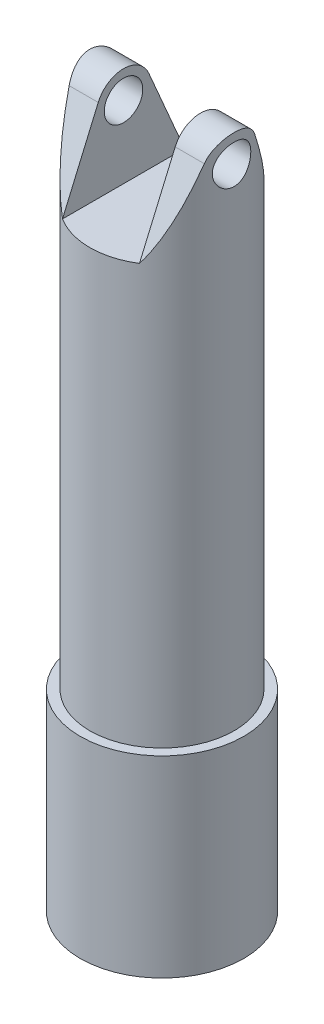
ISO-10303-21;
HEADER;
FILE_DESCRIPTION(('STEP AP214'),'2;1');
FILE_NAME('part.step','',(''),(''),'','','');
FILE_SCHEMA(('AUTOMOTIVE_DESIGN { 1 0 10303 214 1 1 1 1 }'));
ENDSEC;
DATA;
#1=APPLICATION_CONTEXT('core data for automotive mechanical design processes');
#2=APPLICATION_PROTOCOL_DEFINITION('international standard','automotive_design',2000,#1);
#3=PRODUCT_CONTEXT('',#1,'mechanical');
#4=PRODUCT('Part','Part','',(#3));
#5=PRODUCT_RELATED_PRODUCT_CATEGORY('part','',(#4));
#6=PRODUCT_DEFINITION_FORMATION('','',#4);
#7=PRODUCT_DEFINITION_CONTEXT('part definition',#1,'design');
#8=PRODUCT_DEFINITION('design','',#6,#7);
#9=PRODUCT_DEFINITION_SHAPE('','',#8);
#10=(LENGTH_UNIT() NAMED_UNIT(*) SI_UNIT(.MILLI.,.METRE.));
#11=(NAMED_UNIT(*) PLANE_ANGLE_UNIT() SI_UNIT($,.RADIAN.));
#12=(NAMED_UNIT(*) SI_UNIT($,.STERADIAN.) SOLID_ANGLE_UNIT());
#13=UNCERTAINTY_MEASURE_WITH_UNIT(LENGTH_MEASURE(1.E-05),#10,'distance_accuracy_value','');
#14=(GEOMETRIC_REPRESENTATION_CONTEXT(3) GLOBAL_UNCERTAINTY_ASSIGNED_CONTEXT((#13)) GLOBAL_UNIT_ASSIGNED_CONTEXT((#10,
#11,#12)) REPRESENTATION_CONTEXT('',''));
#15=CARTESIAN_POINT('',(0.,0.,0.));
#16=DIRECTION('',(0.,0.,1.));
#17=DIRECTION('',(1.,0.,0.));
#18=AXIS2_PLACEMENT_3D('',#15,#16,#17);
#19=CARTESIAN_POINT('',(0.,40.,0.));
#20=DIRECTION('',(0.,-1.,0.));
#21=DIRECTION('',(0.,0.,-1.));
#22=AXIS2_PLACEMENT_3D('',#19,#20,#21);
#23=CYLINDRICAL_SURFACE('',#22,17.);
#24=CARTESIAN_POINT('',(0.,40.,0.));
#25=DIRECTION('',(0.,1.,0.));
#26=DIRECTION('',(0.,0.,1.));
#27=AXIS2_PLACEMENT_3D('',#24,#25,#26);
#28=CIRCLE('',#27,17.);
#29=CARTESIAN_POINT('',(0.,40.,17.));
#30=VERTEX_POINT('',#29);
#31=EDGE_CURVE('E144',#30,#30,#28,.T.);
#32=ORIENTED_EDGE('',*,*,#31,.F.);
#33=EDGE_LOOP('',(#32));
#34=FACE_BOUND('',#33,.T.);
#35=CARTESIAN_POINT('',(0.,0.,0.));
#36=DIRECTION('',(0.,1.,0.));
#37=DIRECTION('',(0.,0.,1.));
#38=AXIS2_PLACEMENT_3D('',#35,#36,#37);
#39=CIRCLE('',#38,17.);
#40=CARTESIAN_POINT('',(0.,0.,17.));
#41=VERTEX_POINT('',#40);
#42=EDGE_CURVE('E137',#41,#41,#39,.T.);
#43=ORIENTED_EDGE('',*,*,#42,.T.);
#44=EDGE_LOOP('',(#43));
#45=FACE_BOUND('',#44,.T.);
#46=ADVANCED_FACE('F47',(#34,#45),#23,.T.);
#47=CARTESIAN_POINT('',(0.,40.,0.));
#48=DIRECTION('',(0.,1.,0.));
#49=DIRECTION('',(0.,0.,1.));
#50=AXIS2_PLACEMENT_3D('',#47,#48,#49);
#51=PLANE('',#50);
#52=CARTESIAN_POINT('',(0.,40.,0.));
#53=DIRECTION('',(0.,1.,0.));
#54=DIRECTION('',(0.,0.,1.));
#55=AXIS2_PLACEMENT_3D('',#52,#53,#54);
#56=CIRCLE('',#55,15.);
#57=CARTESIAN_POINT('',(0.,40.,15.));
#58=VERTEX_POINT('',#57);
#59=EDGE_CURVE('E131',#58,#58,#56,.T.);
#60=ORIENTED_EDGE('',*,*,#59,.F.);
#61=EDGE_LOOP('',(#60));
#62=FACE_BOUND('',#61,.T.);
#63=ORIENTED_EDGE('',*,*,#31,.T.);
#64=EDGE_LOOP('',(#63));
#65=FACE_BOUND('',#64,.T.);
#66=ADVANCED_FACE('F260',(#62,#65),#51,.T.);
#67=CARTESIAN_POINT('',(0.,0.,0.));
#68=DIRECTION('',(0.,1.,0.));
#69=DIRECTION('',(0.,0.,1.));
#70=AXIS2_PLACEMENT_3D('',#67,#68,#69);
#71=PLANE('',#70);
#72=ORIENTED_EDGE('',*,*,#42,.F.);
#73=EDGE_LOOP('',(#72));
#74=FACE_BOUND('',#73,.T.);
#75=ADVANCED_FACE('F266',(#74),#71,.F.);
#76=CARTESIAN_POINT('',(0.,150.,0.));
#77=DIRECTION('',(0.,-1.,0.));
#78=DIRECTION('',(0.,0.,-1.));
#79=AXIS2_PLACEMENT_3D('',#76,#77,#78);
#80=CYLINDRICAL_SURFACE('',#79,15.);
#81=CARTESIAN_POINT('',(-15.,138.,0.));
#82=CARTESIAN_POINT('',(-14.9999966762032,138.00000523387,-0.220509111665708));
#83=CARTESIAN_POINT('',(-14.995089723243,138.018295228379,-0.441074320443679));
#84=CARTESIAN_POINT('',(-14.9759914724332,138.090842461477,-0.875850902708924));
#85=CARTESIAN_POINT('',(-14.9617957066517,138.145117008852,-1.09005916663817));
#86=CARTESIAN_POINT('',(-14.9256866650558,138.287743333728,-1.50578317809062));
#87=CARTESIAN_POINT('',(-14.9037833426075,138.376051175332,-1.70731490203056));
#88=CARTESIAN_POINT('',(-14.8545739830336,138.584074485333,-2.0927073727853));
#89=CARTESIAN_POINT('',(-14.8272675859036,138.703792046719,-2.27656694089924));
#90=CARTESIAN_POINT('',(-14.7694922980399,138.974167032827,-2.62565900748002));
#91=CARTESIAN_POINT('',(-14.7389693535736,139.125417336017,-2.79042337972557));
#92=CARTESIAN_POINT('',(-14.6785481935918,139.453296966127,-3.09257427321276));
#93=CARTESIAN_POINT('',(-14.6486500589449,139.629929555235,-3.22995726991329));
#94=CARTESIAN_POINT('',(-14.5923107492874,140.007296469651,-3.4757281848683));
#95=CARTESIAN_POINT('',(-14.5659377712648,140.208392656523,-3.58357755472974));
#96=CARTESIAN_POINT('',(-14.5204295463637,140.626680222185,-3.76375096153987));
#97=CARTESIAN_POINT('',(-14.5012929650653,140.843868624663,-3.83608154902737));
#98=CARTESIAN_POINT('',(-14.472982316048,141.28299107565,-3.94153840453008));
#99=CARTESIAN_POINT('',(-14.4635929562298,141.504707079861,-3.97551340489384));
#100=CARTESIAN_POINT('',(-14.4551966183274,141.950875366613,-4.0059406941164));
#101=CARTESIAN_POINT('',(-14.4561877002889,142.175327130048,-4.00239999411507));
#102=CARTESIAN_POINT('',(-14.4682475760406,142.613970830748,-3.95857020005398));
#103=CARTESIAN_POINT('',(-14.4790347102306,142.828274364077,-3.91930812129529));
#104=CARTESIAN_POINT('',(-14.5090202616138,143.247136668912,-3.80679497444365));
#105=CARTESIAN_POINT('',(-14.5282193510522,143.451694660151,-3.7335411898599));
#106=CARTESIAN_POINT('',(-14.5731132349677,143.847936287617,-3.55428713930513));
#107=CARTESIAN_POINT('',(-14.5988788563741,144.039448678572,-3.4479268227557));
#108=CARTESIAN_POINT('',(-14.6539645928489,144.402268317703,-3.20573007647556));
#109=CARTESIAN_POINT('',(-14.6832854071037,144.573571578313,-3.06988784448504));
#110=CARTESIAN_POINT('',(-14.7433502125973,144.89697799491,-2.76733214526839));
#111=CARTESIAN_POINT('',(-14.7741094297766,145.04827263663,-2.599756254566));
#112=CARTESIAN_POINT('',(-14.8327276255263,145.320777560701,-2.24123533641276));
#113=CARTESIAN_POINT('',(-14.8605864897711,145.441986657405,-2.05028938841019));
#114=CARTESIAN_POINT('',(-14.9104364079659,145.651235805649,-1.64919651099491));
#115=CARTESIAN_POINT('',(-14.9324014566712,145.739129540897,-1.43896980510358));
#116=CARTESIAN_POINT('',(-14.96780088802,145.878094377627,-1.0060045887808));
#117=CARTESIAN_POINT('',(-14.981237134675,145.929173525448,-0.783268823856652));
#118=CARTESIAN_POINT('',(-14.9977831711677,145.991789753836,-0.338508166291036));
#119=CARTESIAN_POINT('',(-15.0011799494192,146.004426079702,-0.116648475282767));
#120=CARTESIAN_POINT('',(-14.9980894338339,145.992833671506,0.326020091802389));
#121=CARTESIAN_POINT('',(-14.9916031616071,145.968608747788,0.546829074124218));
#122=CARTESIAN_POINT('',(-14.9696607099204,145.88488310508,0.977204899803545));
#123=CARTESIAN_POINT('',(-14.9543605309265,145.825995507604,1.18689970405555));
#124=CARTESIAN_POINT('',(-14.9165258978828,145.675328110984,1.59341394235211));
#125=CARTESIAN_POINT('',(-14.8939906599234,145.583544747499,1.79023197843204));
#126=CARTESIAN_POINT('',(-14.8435132111904,145.367652225639,2.16967694933589));
#127=CARTESIAN_POINT('',(-14.8154737320985,145.242945066405,2.35195037692235));
#128=CARTESIAN_POINT('',(-14.7572290473119,144.965496739684,2.69336927079428));
#129=CARTESIAN_POINT('',(-14.7270234145527,144.812750034798,2.85251015759836));
#130=CARTESIAN_POINT('',(-14.6667949173317,144.478428845011,3.14777848957545));
#131=CARTESIAN_POINT('',(-14.6368012285772,144.296162877209,3.28313038499625));
#132=CARTESIAN_POINT('',(-14.5813289436636,143.910870607801,3.52134382370241));
#133=CARTESIAN_POINT('',(-14.5558501591602,143.707845172756,3.62420672244342));
#134=CARTESIAN_POINT('',(-14.5125853674305,143.287809385847,3.79374823172204));
#135=CARTESIAN_POINT('',(-14.4947549662348,143.070888376362,3.86063624507839));
#136=CARTESIAN_POINT('',(-14.4687965026614,142.628321360653,3.95682410237656));
#137=CARTESIAN_POINT('',(-14.4606659608681,142.402677599313,3.98613355205236));
#138=CARTESIAN_POINT('',(-14.4552348910192,141.957010424211,4.00577979307212));
#139=CARTESIAN_POINT('',(-14.4575879532022,141.737045359427,3.99736311235129));
#140=CARTESIAN_POINT('',(-14.4720479199639,141.30179297193,3.94468751999858));
#141=CARTESIAN_POINT('',(-14.4841545735456,141.08650552899,3.9004295306998));
#142=CARTESIAN_POINT('',(-14.5165514219021,140.66828849576,3.77805031399794));
#143=CARTESIAN_POINT('',(-14.5367777005106,140.465276314541,3.70019322151266));
#144=CARTESIAN_POINT('',(-14.5831363626058,140.075042338926,3.51303109124666));
#145=CARTESIAN_POINT('',(-14.6092696723953,139.887823027398,3.40372112049205));
#146=CARTESIAN_POINT('',(-14.6654584288421,139.528539281008,3.15297818537665));
#147=CARTESIAN_POINT('',(-14.6956066620426,139.357082930048,3.01069459535829));
#148=CARTESIAN_POINT('',(-14.7559100756513,139.040075096665,2.69966107022194));
#149=CARTESIAN_POINT('',(-14.7860652559664,138.894529922662,2.53090470871748));
#150=CARTESIAN_POINT('',(-14.8437562480818,138.630415524706,2.16735996217739));
#151=CARTESIAN_POINT('',(-14.8712222262917,138.512489978701,1.97209192350356));
#152=CARTESIAN_POINT('',(-14.9196762020573,138.311325168141,1.56377728083377));
#153=CARTESIAN_POINT('',(-14.9406683536717,138.228063648673,1.35074218939259));
#154=CARTESIAN_POINT('',(-14.9710950502695,138.109449429169,0.948749409761977));
#155=CARTESIAN_POINT('',(-14.9818554118521,138.068501232815,0.761524033130067));
#156=CARTESIAN_POINT('',(-14.9963089807291,138.013775587666,0.382879590634149));
#157=CARTESIAN_POINT('',(-15.0000028859454,137.9999954556,0.191460940809719));
#158=CARTESIAN_POINT('',(-15.,138.,0.));
#159=B_SPLINE_CURVE_WITH_KNOTS('',3,(#81,#82,#83,#84,#85,#86,#87,#88,#89,#90,#91,#92,#93,#94,
#95,#96,#97,#98,#99,#100,#101,#102,#103,#104,#105,#106,#107,#108,#109,#110,#111,#112,#113,#114,
#115,#116,#117,#118,#119,#120,#121,#122,#123,#124,#125,#126,#127,#128,#129,#130,#131,#132,#133,
#134,#135,#136,#137,#138,#139,#140,#141,#142,#143,#144,#145,#146,#147,#148,#149,#150,#151,#152,
#153,#154,#155,#156,#157,#158),.UNSPECIFIED.,.T.,.F.,(4,2,2,2,2,2,2,2,2,2,2,2,2,2,2,2,2,2,2,2,2,
2,2,2,2,2,2,2,2,2,2,2,2,2,2,2,2,2,4),(0.,0.660825197899137,1.32196848752289,1.98226110594384,
2.6425977341735,3.31669795909933,3.99088489850297,4.67665165046457,5.36229188259397,
6.03244316500938,6.7024692080864,7.35382004091994,8.00522293625877,8.66397346692996,
9.32285376235258,10.0032251962464,10.6836234387519,11.3669761920608,12.0501795438028,
12.7136543504909,13.377060578507,14.0290707128423,14.6811515155123,15.346005720091,
16.0109913651777,16.6947299276558,17.3784399604821,18.0581259539877,18.7376381732797,
19.394866848109,20.0520786104838,20.704215309038,21.3564543425319,22.0278867914996,
22.6994824867208,23.3854450456898,24.0709665229755,24.6447963799386,25.2185695593995),.UNSPECIFIED.);
#160=CARTESIAN_POINT('',(-15.,138.,0.));
#161=VERTEX_POINT('',#160);
#162=EDGE_CURVE('E146',#161,#161,#159,.T.);
#163=ORIENTED_EDGE('',*,*,#162,.T.);
#164=EDGE_LOOP('',(#163));
#165=FACE_BOUND('',#164,.T.);
#166=CARTESIAN_POINT('',(14.456832294801,142.,-4.));
#167=CARTESIAN_POINT('',(14.456836113945,141.779648124519,-3.99999468631742));
#168=CARTESIAN_POINT('',(14.4619252909935,141.559239999048,-3.98172986449485));
#169=CARTESIAN_POINT('',(14.4816712231019,141.124789156887,-3.90929166520474));
#170=CARTESIAN_POINT('',(14.4963327781587,140.910749690044,-3.85510027241905));
#171=CARTESIAN_POINT('',(14.5334475035368,140.495383860106,-3.71271691120146));
#172=CARTESIAN_POINT('',(14.5558897136841,140.294040082343,-3.62457275084354));
#173=CARTESIAN_POINT('',(14.606023098408,139.90896651988,-3.41693569127405));
#174=CARTESIAN_POINT('',(14.6337146806885,139.725238104986,-3.29744035682897));
#175=CARTESIAN_POINT('',(14.6920027910693,139.376014906025,-3.02729695749118));
#176=CARTESIAN_POINT('',(14.7226508223289,139.211025965071,-2.87600595008416));
#177=CARTESIAN_POINT('',(14.7829540287301,138.908436846098,-2.54794854568041));
#178=CARTESIAN_POINT('',(14.8126091006688,138.770839507716,-2.37117951069329));
#179=CARTESIAN_POINT('',(14.8681597693684,138.524830123194,-1.99367634174654));
#180=CARTESIAN_POINT('',(14.8939875252459,138.416920962734,-1.79260363975895));
#181=CARTESIAN_POINT('',(14.9383825242367,138.236630729265,-1.37436608945816));
#182=CARTESIAN_POINT('',(14.9569509915253,138.164243665437,-1.15720396175019));
#183=CARTESIAN_POINT('',(14.9843710715292,138.058689559528,-0.718231923620166));
#184=CARTESIAN_POINT('',(14.9934355350053,138.024662046748,-0.49664244840182));
#185=CARTESIAN_POINT('',(15.001570492355,137.994085759786,-0.0507271070171379));
#186=CARTESIAN_POINT('',(15.0006426589323,137.99753071274,0.173598294877076));
#187=CARTESIAN_POINT('',(14.9890535171952,138.041195625079,0.612628474222694));
#188=CARTESIAN_POINT('',(14.9786382805395,138.080485915273,0.827433201442205));
#189=CARTESIAN_POINT('',(14.9495349718099,138.193224275564,1.24728263114213));
#190=CARTESIAN_POINT('',(14.9308464280136,138.266674293372,1.45232677636124));
#191=CARTESIAN_POINT('',(14.886931381996,138.446359695185,1.84920789029504));
#192=CARTESIAN_POINT('',(14.8616417575466,138.552913614201,2.04089337265881));
#193=CARTESIAN_POINT('',(14.8072493701969,138.795537639019,2.4039799975293));
#194=CARTESIAN_POINT('',(14.7781458644853,138.931613498058,2.57537717617275));
#195=CARTESIAN_POINT('',(14.7182254587482,139.234353715866,2.89857073893017));
#196=CARTESIAN_POINT('',(14.6873833872759,139.401828890091,3.04960384035149));
#197=CARTESIAN_POINT('',(14.6282681005693,139.760049352486,3.32162664209938));
#198=CARTESIAN_POINT('',(14.5999950420307,139.950796058431,3.44261451061105));
#199=CARTESIAN_POINT('',(14.549118045243,140.351800203619,3.651693583714));
#200=CARTESIAN_POINT('',(14.5265501404503,140.562170701728,3.73957733196031));
#201=CARTESIAN_POINT('',(14.4900865003605,140.995452998808,3.87848003366226));
#202=CARTESIAN_POINT('',(14.4761886145698,141.218361672869,3.92950812921311));
#203=CARTESIAN_POINT('',(14.459096712616,141.663254422078,3.99193514186922));
#204=CARTESIAN_POINT('',(14.4555952643646,141.885067097248,4.00447265242678));
#205=CARTESIAN_POINT('',(14.4588515677209,142.327619545611,3.99269962245616));
#206=CARTESIAN_POINT('',(14.4656082275034,142.548359430478,3.96839300344559));
#207=CARTESIAN_POINT('',(14.4883224864021,142.978113188185,3.88462543740026));
#208=CARTESIAN_POINT('',(14.5041007939926,143.187270875875,3.82584895825866));
#209=CARTESIAN_POINT('',(14.542905379049,143.592759262719,3.67557973450926));
#210=CARTESIAN_POINT('',(14.5659326029695,143.789088282855,3.58408271753295));
#211=CARTESIAN_POINT('',(14.6172714494615,144.168109914871,3.36865811017419));
#212=CARTESIAN_POINT('',(14.6456880974578,144.350407951779,3.2440619047585));
#213=CARTESIAN_POINT('',(14.7043568386728,144.691926603406,2.96680455975028));
#214=CARTESIAN_POINT('',(14.7346092762046,144.851142869908,2.81413814445932));
#215=CARTESIAN_POINT('',(14.7945992976893,145.1467049465,2.47980756500968));
#216=CARTESIAN_POINT('',(14.824296730477,145.282256753957,2.2974328320177));
#217=CARTESIAN_POINT('',(14.8789334003425,145.520821974821,1.91185687188149));
#218=CARTESIAN_POINT('',(14.9038728906581,145.623837120158,1.70865675403778));
#219=CARTESIAN_POINT('',(14.9460230179852,145.793459264723,1.28862826965176));
#220=CARTESIAN_POINT('',(14.9632911696077,145.860338038887,1.07191570576468));
#221=CARTESIAN_POINT('',(14.9884060757449,145.956577456129,0.629798769462646));
#222=CARTESIAN_POINT('',(14.9962549180996,145.985946413549,0.404396334640492));
#223=CARTESIAN_POINT('',(15.0015482687538,146.005811647483,-0.041284002692295));
#224=CARTESIAN_POINT('',(14.9993045257616,145.997472638262,-0.261507023055725));
#225=CARTESIAN_POINT('',(14.9853698195772,145.94486301285,-0.697296609261435));
#226=CARTESIAN_POINT('',(14.9736792110957,145.900593745766,-0.912863349625629));
#227=CARTESIAN_POINT('',(14.9422262078185,145.778038790163,-1.33182024692843));
#228=CARTESIAN_POINT('',(14.9225199437846,145.699989413055,-1.53528402370309));
#229=CARTESIAN_POINT('',(14.8770963303299,145.512300796508,-1.92634419694272));
#230=CARTESIAN_POINT('',(14.8513781379851,145.402657126774,-2.1139383633243));
#231=CARTESIAN_POINT('',(14.7958266244824,145.151483455726,-2.47335653734734));
#232=CARTESIAN_POINT('',(14.7659018674327,145.009181238603,-2.64462672346663));
#233=CARTESIAN_POINT('',(14.7056800015451,144.69819450127,-2.96125074312266));
#234=CARTESIAN_POINT('',(14.6753827967944,144.529503048361,-3.10659774486097));
#235=CARTESIAN_POINT('',(14.6170791927771,144.166063208365,-3.37041400465123));
#236=CARTESIAN_POINT('',(14.5891378244929,143.970823372686,-3.48822188522467));
#237=CARTESIAN_POINT('',(14.5396278780694,143.56258737828,-3.68917378060109));
#238=CARTESIAN_POINT('',(14.5180551344989,143.349602942921,-3.77234046734664));
#239=CARTESIAN_POINT('',(14.4867200130775,142.947837327897,-3.89076248504962));
#240=CARTESIAN_POINT('',(14.4756028054439,142.760797470887,-3.93163036798979));
#241=CARTESIAN_POINT('',(14.4606577042314,142.382518884012,-3.98624988587759));
#242=CARTESIAN_POINT('',(14.4568289795203,142.191280635422,-4.0000046126432));
#243=CARTESIAN_POINT('',(14.456832294801,142.,-4.));
#244=B_SPLINE_CURVE_WITH_KNOTS('',3,(#166,#167,#168,#169,#170,#171,#172,#173,#174,#175,#176,
#177,#178,#179,#180,#181,#182,#183,#184,#185,#186,#187,#188,#189,#190,#191,#192,#193,#194,#195,
#196,#197,#198,#199,#200,#201,#202,#203,#204,#205,#206,#207,#208,#209,#210,#211,#212,#213,#214,
#215,#216,#217,#218,#219,#220,#221,#222,#223,#224,#225,#226,#227,#228,#229,#230,#231,#232,#233,
#234,#235,#236,#237,#238,#239,#240,#241,#242,#243),.UNSPECIFIED.,.T.,.F.,(4,2,2,2,2,2,2,2,2,2,2,
2,2,2,2,2,2,2,2,2,2,2,2,2,2,2,2,2,2,2,2,2,2,2,2,2,2,2,4),(0.,0.66035225623206,1.32103589570041,
1.9807926231924,2.64060061312211,3.31531832260425,3.99010594248923,4.67570414741609,
5.36118668608494,6.03096608632962,6.70063336771207,7.35341141601608,8.00622668881391,
8.6655289781114,9.32495986788983,10.0046352460066,10.6843520527916,11.3682603019536,
12.0519988484194,12.7153066848897,13.3785439269193,14.0290370087007,14.6796150573457,
15.3444926994046,16.0094954308787,16.6937181392419,17.3779044202112,18.0568707918772,
18.7356866392293,19.3936810983785,20.0516508523085,20.7050902974225,21.3586214153685,
22.0295770798807,22.7007093076701,23.3866007797608,24.0720426420754,24.6453393534799,
25.2185706858622),.UNSPECIFIED.);
#245=CARTESIAN_POINT('',(14.456832294801,142.,-4.));
#246=VERTEX_POINT('',#245);
#247=EDGE_CURVE('E234',#246,#246,#244,.T.);
#248=ORIENTED_EDGE('',*,*,#247,.T.);
#249=EDGE_LOOP('',(#248));
#250=FACE_BOUND('',#249,.T.);
#251=CARTESIAN_POINT('',(0.,127.,0.));
#252=DIRECTION('',(0.,-1.,0.));
#253=DIRECTION('',(0.,0.,-1.));
#254=AXIS2_PLACEMENT_3D('',#251,#252,#253);
#255=CIRCLE('',#254,15.);
#256=CARTESIAN_POINT('',(-8.,127.,-12.6885775404495));
#257=VERTEX_POINT('',#256);
#258=CARTESIAN_POINT('',(8.,127.,-12.6885775404495));
#259=VERTEX_POINT('',#258);
#260=EDGE_CURVE('E130',#257,#259,#255,.T.);
#261=ORIENTED_EDGE('',*,*,#260,.T.);
#262=CARTESIAN_POINT('',(0.,156.472043197792,0.));
#263=DIRECTION('',(0.,-0.395437990509759,0.918492675888928));
#264=DIRECTION('',(0.,-0.918492675888928,-0.395437990509759));
#265=AXIS2_PLACEMENT_3D('',#262,#263,#264);
#266=ELLIPSE('',#265,37.9326224591206,15.);
#267=CARTESIAN_POINT('',(14.0488728226426,144.263010824076,-5.25634591833657));
#268=VERTEX_POINT('',#267);
#269=EDGE_CURVE('E167',#259,#268,#266,.T.);
#270=ORIENTED_EDGE('',*,*,#269,.T.);
#271=CARTESIAN_POINT('',(14.0488728226426,144.263010824076,-5.25634591833657));
#272=CARTESIAN_POINT('',(14.0730682857895,144.413287294667,-5.19165991522057));
#273=CARTESIAN_POINT('',(14.0991415563376,144.560499999913,-5.1206304531022));
#274=CARTESIAN_POINT('',(14.1541582949781,144.847874445187,-4.96654197021879));
#275=CARTESIAN_POINT('',(14.1831009176378,144.988038243884,-4.88348648952657));
#276=CARTESIAN_POINT('',(14.2429769512347,145.260438738813,-4.70599196365513));
#277=CARTESIAN_POINT('',(14.2739097451552,145.392677867622,-4.61155643880264));
#278=CARTESIAN_POINT('',(14.3368696577274,145.648505246797,-4.41192969247633));
#279=CARTESIAN_POINT('',(14.3688968498729,145.772092914473,-4.30673774771242));
#280=CARTESIAN_POINT('',(14.4331192618181,146.009789486984,-4.08634678139645));
#281=CARTESIAN_POINT('',(14.4653143548767,146.123904677642,-3.97115450148659));
#282=CARTESIAN_POINT('',(14.5290180551218,146.342078638881,-3.73135730306619));
#283=CARTESIAN_POINT('',(14.5605264237946,146.446133957251,-3.60674917930501));
#284=CARTESIAN_POINT('',(14.6219785188898,146.643429085461,-3.34892514528216));
#285=CARTESIAN_POINT('',(14.6519225896156,146.736671280836,-3.21571114374234));
#286=CARTESIAN_POINT('',(14.7094326705999,146.911683207237,-2.94146493665942));
#287=CARTESIAN_POINT('',(14.7369987851946,146.99345344171,-2.80043307458281));
#288=CARTESIAN_POINT('',(14.7890589866116,147.145069587004,-2.51105566110172));
#289=CARTESIAN_POINT('',(14.8135446661311,147.214883044416,-2.36269157028341));
#290=CARTESIAN_POINT('',(14.8586508465141,147.34166696737,-2.06006927186809));
#291=CARTESIAN_POINT('',(14.879272858654,147.398642456268,-1.90581339738943));
#292=CARTESIAN_POINT('',(14.916058984103,147.499217939406,-1.59250054127738));
#293=CARTESIAN_POINT('',(14.9322236788274,147.542819678212,-1.43344418882725));
#294=CARTESIAN_POINT('',(14.959613871675,147.616190750926,-1.11175675713965));
#295=CARTESIAN_POINT('',(14.9708396687524,147.645960922074,-0.949125894895108));
#296=CARTESIAN_POINT('',(14.9875106663862,147.690013595157,-0.631170177315254));
#297=CARTESIAN_POINT('',(14.9932544794736,147.705097195053,-0.475971518515211));
#298=CARTESIAN_POINT('',(14.9999024705345,147.722545844528,-0.164759448827054));
#299=CARTESIAN_POINT('',(15.0008068317817,147.724911375748,-0.00874606901703434));
#300=CARTESIAN_POINT('',(14.9977512486501,147.716900041911,0.302877154568026));
#301=CARTESIAN_POINT('',(14.9937921318593,147.706525344779,0.458487062484552));
#302=CARTESIAN_POINT('',(14.9811201303515,147.673146299852,0.76814852838396));
#303=CARTESIAN_POINT('',(14.9724072855683,147.650142058153,0.92220009944662));
#304=CARTESIAN_POINT('',(14.9508323563845,147.592714930718,1.2225038713993));
#305=CARTESIAN_POINT('',(14.9381184379363,147.558698711464,1.36884479020477));
#306=CARTESIAN_POINT('',(14.9087859875391,147.479383793888,1.65808372265229));
#307=CARTESIAN_POINT('',(14.8921661485218,147.434081318454,1.80098056608949));
#308=CARTESIAN_POINT('',(14.8554338321744,147.3325925514,2.08235503599259));
#309=CARTESIAN_POINT('',(14.8353222368595,147.276409007917,2.2208337680386));
#310=CARTESIAN_POINT('',(14.7920880994451,147.153596017898,2.49261049218595));
#311=CARTESIAN_POINT('',(14.7689644713167,147.086962801816,2.62590659300098));
#312=CARTESIAN_POINT('',(14.6940995775556,146.866882049699,3.02633394981739));
#313=CARTESIAN_POINT('',(14.6382417432665,146.696911930107,3.28384004859542));
#314=CARTESIAN_POINT('',(14.5212752411457,146.318574315839,3.76758317043841));
#315=CARTESIAN_POINT('',(14.4601648491399,146.110194187028,3.99380986184889));
#316=CARTESIAN_POINT('',(14.3674713305454,145.766650112165,4.31147911078041));
#317=CARTESIAN_POINT('',(14.3355940765881,145.643476037607,4.41606080568115));
#318=CARTESIAN_POINT('',(14.2729276839038,145.388527868188,4.61458051605993));
#319=CARTESIAN_POINT('',(14.2421385255637,145.256753928462,4.70851872345635));
#320=CARTESIAN_POINT('',(14.1825328007248,144.985321174815,4.88512813385325));
#321=CARTESIAN_POINT('',(14.1537174432797,144.845657621996,4.96779246121053));
#322=CARTESIAN_POINT('',(14.0989377812886,144.559348287062,5.12118532407661));
#323=CARTESIAN_POINT('',(14.0729741784609,144.412700799111,5.19191092416508));
#324=CARTESIAN_POINT('',(14.0488728226426,144.263010824076,5.25634591833657));
#325=B_SPLINE_CURVE_WITH_KNOTS('',3,(#271,#272,#273,#274,#275,#276,#277,#278,#279,#280,#281,
#282,#283,#284,#285,#286,#287,#288,#289,#290,#291,#292,#293,#294,#295,#296,#297,#298,#299,#300,
#301,#302,#303,#304,#305,#306,#307,#308,#309,#310,#311,#312,#313,#314,#315,#316,#317,#318,#319,
#320,#321,#322,#323,#324),.UNSPECIFIED.,.F.,.F.,(4,2,2,2,2,2,2,2,2,2,2,2,2,2,2,2,2,2,2,2,2,2,2,
2,2,2,4),(0.,0.495960336962393,0.991774974856635,1.48743662824426,1.98313163317624,
2.47849502655055,2.97402781306119,3.46945106880488,3.96485257606229,4.46157810915814,
4.95810894019704,5.45457497275848,5.95101094981808,6.41853146078263,6.88603426626079,
7.35345753070493,7.82087686860795,8.27269806968715,8.72467068299492,9.17652929399226,
9.62855128200459,10.5648869596803,11.5015311759413,11.995139290744,12.4887385036192,
12.9826374162267,13.4766575893163),.UNSPECIFIED.);
#326=CARTESIAN_POINT('',(14.0488728226426,144.263010824076,5.25634591833657));
#327=VERTEX_POINT('',#326);
#328=EDGE_CURVE('E117',#268,#327,#325,.T.);
#329=ORIENTED_EDGE('',*,*,#328,.T.);
#330=CARTESIAN_POINT('',(0.,156.472043197792,0.));
#331=DIRECTION('',(0.,-0.395437990509759,-0.918492675888928));
#332=DIRECTION('',(0.,-0.918492675888928,0.395437990509759));
#333=AXIS2_PLACEMENT_3D('',#330,#331,#332);
#334=ELLIPSE('',#333,37.9326224591206,15.);
#335=CARTESIAN_POINT('',(8.,127.,12.6885775404495));
#336=VERTEX_POINT('',#335);
#337=EDGE_CURVE('E103',#327,#336,#334,.T.);
#338=ORIENTED_EDGE('',*,*,#337,.T.);
#339=CARTESIAN_POINT('',(-8.,127.,12.6885775404495));
#340=VERTEX_POINT('',#339);
#341=EDGE_CURVE('E115',#336,#340,#255,.T.);
#342=ORIENTED_EDGE('',*,*,#341,.T.);
#343=CARTESIAN_POINT('',(-14.0488728226426,144.263010824076,5.25634591833657));
#344=VERTEX_POINT('',#343);
#345=EDGE_CURVE('E70',#340,#344,#334,.T.);
#346=ORIENTED_EDGE('',*,*,#345,.T.);
#347=CARTESIAN_POINT('',(-14.0488728226426,144.263010824076,5.25634591833657));
#348=CARTESIAN_POINT('',(-14.0730682857895,144.413287294667,5.19165991522057));
#349=CARTESIAN_POINT('',(-14.0991415563376,144.560499999913,5.1206304531022));
#350=CARTESIAN_POINT('',(-14.1541582949781,144.847874445187,4.96654197021879));
#351=CARTESIAN_POINT('',(-14.1831009176378,144.988038243884,4.88348648952657));
#352=CARTESIAN_POINT('',(-14.2429769512347,145.260438738813,4.70599196365513));
#353=CARTESIAN_POINT('',(-14.2739097451552,145.392677867622,4.61155643880263));
#354=CARTESIAN_POINT('',(-14.3368696577274,145.648505246797,4.41192969247633));
#355=CARTESIAN_POINT('',(-14.3688968498729,145.772092914473,4.30673774771242));
#356=CARTESIAN_POINT('',(-14.4331192618181,146.009789486984,4.08634678139645));
#357=CARTESIAN_POINT('',(-14.4653143548767,146.123904677642,3.97115450148659));
#358=CARTESIAN_POINT('',(-14.5290180551218,146.342078638881,3.73135730306619));
#359=CARTESIAN_POINT('',(-14.5605264237946,146.446133957251,3.606749179305));
#360=CARTESIAN_POINT('',(-14.6219785188898,146.643429085461,3.34892514528215));
#361=CARTESIAN_POINT('',(-14.6519225896156,146.736671280836,3.21571114374234));
#362=CARTESIAN_POINT('',(-14.7094326705999,146.911683207237,2.94146493665942));
#363=CARTESIAN_POINT('',(-14.7369987851946,146.99345344171,2.8004330745828));
#364=CARTESIAN_POINT('',(-14.7890589866116,147.145069587004,2.51105566110171));
#365=CARTESIAN_POINT('',(-14.8135446661311,147.214883044416,2.3626915702834));
#366=CARTESIAN_POINT('',(-14.8586508465141,147.34166696737,2.06006927186809));
#367=CARTESIAN_POINT('',(-14.879272858654,147.398642456268,1.90581339738942));
#368=CARTESIAN_POINT('',(-14.916058984103,147.499217939406,1.59250054127738));
#369=CARTESIAN_POINT('',(-14.9322236788274,147.542819678212,1.43344418882725));
#370=CARTESIAN_POINT('',(-14.959613871675,147.616190750926,1.11175675713965));
#371=CARTESIAN_POINT('',(-14.9708396687524,147.645960922074,0.949125894895106));
#372=CARTESIAN_POINT('',(-14.9875106663862,147.690013595157,0.631170177315253));
#373=CARTESIAN_POINT('',(-14.9932544794736,147.705097195053,0.47597151851521));
#374=CARTESIAN_POINT('',(-14.9999024705345,147.722545844528,0.164759448827053));
#375=CARTESIAN_POINT('',(-15.0008068317817,147.724911375748,0.00874606901703296));
#376=CARTESIAN_POINT('',(-14.9977512486501,147.716900041911,-0.302877154568028));
#377=CARTESIAN_POINT('',(-14.9937921318593,147.706525344779,-0.458487062484554));
#378=CARTESIAN_POINT('',(-14.9811201303515,147.673146299852,-0.768148528383962));
#379=CARTESIAN_POINT('',(-14.9724072855683,147.650142058153,-0.922200099446622));
#380=CARTESIAN_POINT('',(-14.9508323563845,147.592714930718,-1.2225038713993));
#381=CARTESIAN_POINT('',(-14.9381184379363,147.558698711464,-1.36884479020477));
#382=CARTESIAN_POINT('',(-14.9087859875391,147.479383793888,-1.65808372265229));
#383=CARTESIAN_POINT('',(-14.8921661485218,147.434081318454,-1.80098056608949));
#384=CARTESIAN_POINT('',(-14.8554338321744,147.3325925514,-2.0823550359926));
#385=CARTESIAN_POINT('',(-14.8353222368595,147.276409007917,-2.22083376803861));
#386=CARTESIAN_POINT('',(-14.7920880994451,147.153596017898,-2.49261049218595));
#387=CARTESIAN_POINT('',(-14.7689644713167,147.086962801816,-2.62590659300098));
#388=CARTESIAN_POINT('',(-14.6940995775556,146.866882049699,-3.02633394981739));
#389=CARTESIAN_POINT('',(-14.6382417432665,146.696911930107,-3.28384004859542));
#390=CARTESIAN_POINT('',(-14.5212752411457,146.318574315839,-3.76758317043842));
#391=CARTESIAN_POINT('',(-14.4601648491399,146.110194187028,-3.99380986184889));
#392=CARTESIAN_POINT('',(-14.3674713305454,145.766650112165,-4.31147911078041));
#393=CARTESIAN_POINT('',(-14.3355940765881,145.643476037607,-4.41606080568115));
#394=CARTESIAN_POINT('',(-14.2729276839038,145.388527868188,-4.61458051605992));
#395=CARTESIAN_POINT('',(-14.2421385255637,145.256753928462,-4.70851872345635));
#396=CARTESIAN_POINT('',(-14.1825328007248,144.985321174815,-4.88512813385325));
#397=CARTESIAN_POINT('',(-14.1537174432797,144.845657621996,-4.96779246121053));
#398=CARTESIAN_POINT('',(-14.0989377812886,144.559348287062,-5.12118532407662));
#399=CARTESIAN_POINT('',(-14.0729741784609,144.412700799111,-5.19191092416508));
#400=CARTESIAN_POINT('',(-14.0488728226426,144.263010824076,-5.25634591833657));
#401=B_SPLINE_CURVE_WITH_KNOTS('',3,(#347,#348,#349,#350,#351,#352,#353,#354,#355,#356,#357,
#358,#359,#360,#361,#362,#363,#364,#365,#366,#367,#368,#369,#370,#371,#372,#373,#374,#375,#376,
#377,#378,#379,#380,#381,#382,#383,#384,#385,#386,#387,#388,#389,#390,#391,#392,#393,#394,#395,
#396,#397,#398,#399,#400),.UNSPECIFIED.,.F.,.F.,(4,2,2,2,2,2,2,2,2,2,2,2,2,2,2,2,2,2,2,2,2,2,2,
2,2,2,4),(0.,0.495960336962393,0.991774974856635,1.48743662824426,1.98313163317624,
2.47849502655055,2.97402781306119,3.46945106880488,3.96485257606229,4.46157810915814,
4.95810894019704,5.45457497275848,5.95101094981808,6.41853146078263,6.88603426626079,
7.35345753070493,7.82087686860795,8.27269806968715,8.72467068299492,9.17652929399226,
9.62855128200458,10.5648869596803,11.5015311759413,11.9951392907439,12.4887385036192,
12.9826374162267,13.4766575893163),.UNSPECIFIED.);
#402=CARTESIAN_POINT('',(-14.0488728226426,144.263010824076,-5.25634591833657));
#403=VERTEX_POINT('',#402);
#404=EDGE_CURVE('E208',#344,#403,#401,.T.);
#405=ORIENTED_EDGE('',*,*,#404,.T.);
#406=EDGE_CURVE('E187',#403,#257,#266,.T.);
#407=ORIENTED_EDGE('',*,*,#406,.T.);
#408=EDGE_LOOP('',(#261,#270,#329,#338,#342,#346,#405,#407));
#409=FACE_BOUND('',#408,.T.);
#410=ORIENTED_EDGE('',*,*,#59,.T.);
#411=EDGE_LOOP('',(#410));
#412=FACE_BOUND('',#411,.T.);
#413=ADVANCED_FACE('F113',(#165,#250,#409,#412),#80,.T.);
#414=CARTESIAN_POINT('',(-8.,127.,-15.));
#415=DIRECTION('',(0.,-1.,0.));
#416=DIRECTION('',(0.,0.,-1.));
#417=AXIS2_PLACEMENT_3D('',#414,#415,#416);
#418=PLANE('',#417);
#419=DIRECTION('',(0.,0.,1.));
#420=VECTOR('',#419,1.);
#421=CARTESIAN_POINT('',(8.,127.,-15.));
#422=LINE('',#421,#420);
#423=EDGE_CURVE('E126',#259,#336,#422,.T.);
#424=ORIENTED_EDGE('',*,*,#423,.F.);
#425=ORIENTED_EDGE('',*,*,#260,.F.);
#426=DIRECTION('',(0.,0.,1.));
#427=VECTOR('',#426,1.);
#428=CARTESIAN_POINT('',(-8.,127.,-15.));
#429=LINE('',#428,#427);
#430=EDGE_CURVE('E128',#257,#340,#429,.T.);
#431=ORIENTED_EDGE('',*,*,#430,.T.);
#432=ORIENTED_EDGE('',*,*,#341,.F.);
#433=EDGE_LOOP('',(#424,#425,#431,#432));
#434=FACE_BOUND('',#433,.T.);
#435=ADVANCED_FACE('F124',(#434),#418,.F.);
#436=CARTESIAN_POINT('',(8.,173.,-15.));
#437=DIRECTION('',(1.,0.,0.));
#438=DIRECTION('',(0.,0.,-1.));
#439=AXIS2_PLACEMENT_3D('',#436,#437,#438);
#440=PLANE('',#439);
#441=CARTESIAN_POINT('',(8.,142.,0.));
#442=DIRECTION('',(1.,0.,0.));
#443=DIRECTION('',(0.,0.,-1.));
#444=AXIS2_PLACEMENT_3D('',#441,#442,#443);
#445=CIRCLE('',#444,4.);
#446=CARTESIAN_POINT('',(8.,142.,-4.));
#447=VERTEX_POINT('',#446);
#448=EDGE_CURVE('E166',#447,#447,#445,.T.);
#449=ORIENTED_EDGE('',*,*,#448,.T.);
#450=EDGE_LOOP('',(#449));
#451=FACE_BOUND('',#450,.T.);
#452=CARTESIAN_POINT('',(8.,142.,0.));
#453=DIRECTION('',(1.,0.,0.));
#454=DIRECTION('',(0.,0.,-1.));
#455=AXIS2_PLACEMENT_3D('',#452,#453,#454);
#456=CIRCLE('',#455,5.72279568070526);
#457=CARTESIAN_POINT('',(8.,144.263010824076,5.25634591833658));
#458=VERTEX_POINT('',#457);
#459=CARTESIAN_POINT('',(8.,144.263010824076,-5.25634591833657));
#460=VERTEX_POINT('',#459);
#461=EDGE_CURVE('E119',#458,#460,#456,.F.);
#462=ORIENTED_EDGE('',*,*,#461,.T.);
#463=DIRECTION('',(0.,-0.918492675888928,-0.395437990509759));
#464=VECTOR('',#463,1.);
#465=CARTESIAN_POINT('',(8.,164.967400018814,3.65749985618241));
#466=LINE('',#465,#464);
#467=EDGE_CURVE('E135',#460,#259,#466,.T.);
#468=ORIENTED_EDGE('',*,*,#467,.T.);
#469=ORIENTED_EDGE('',*,*,#423,.T.);
#470=DIRECTION('',(0.,0.918492675888928,-0.395437990509759));
#471=VECTOR('',#470,1.);
#472=CARTESIAN_POINT('',(8.,175.863606960357,-8.3486359863343));
#473=LINE('',#472,#471);
#474=EDGE_CURVE('E100',#336,#458,#473,.T.);
#475=ORIENTED_EDGE('',*,*,#474,.T.);
#476=EDGE_LOOP('',(#462,#468,#469,#475));
#477=FACE_BOUND('',#476,.T.);
#478=ADVANCED_FACE('F134',(#451,#477),#440,.F.);
#479=CARTESIAN_POINT('',(-8.,173.,-15.));
#480=DIRECTION('',(-1.,0.,0.));
#481=DIRECTION('',(0.,0.,1.));
#482=AXIS2_PLACEMENT_3D('',#479,#480,#481);
#483=PLANE('',#482);
#484=CARTESIAN_POINT('',(-8.,142.,0.));
#485=DIRECTION('',(-1.,0.,0.));
#486=DIRECTION('',(0.,0.,1.));
#487=AXIS2_PLACEMENT_3D('',#484,#485,#486);
#488=CIRCLE('',#487,4.);
#489=CARTESIAN_POINT('',(-8.,142.,4.));
#490=VERTEX_POINT('',#489);
#491=EDGE_CURVE('E162',#490,#490,#488,.T.);
#492=ORIENTED_EDGE('',*,*,#491,.T.);
#493=EDGE_LOOP('',(#492));
#494=FACE_BOUND('',#493,.T.);
#495=ORIENTED_EDGE('',*,*,#430,.F.);
#496=DIRECTION('',(0.,0.918492675888928,0.395437990509759));
#497=VECTOR('',#496,1.);
#498=CARTESIAN_POINT('',(-8.,164.967400018814,3.65749985618241));
#499=LINE('',#498,#497);
#500=CARTESIAN_POINT('',(-8.,144.263010824076,-5.25634591833657));
#501=VERTEX_POINT('',#500);
#502=EDGE_CURVE('E11',#257,#501,#499,.T.);
#503=ORIENTED_EDGE('',*,*,#502,.T.);
#504=CARTESIAN_POINT('',(-8.,142.,0.));
#505=DIRECTION('',(-1.,0.,0.));
#506=DIRECTION('',(0.,0.,1.));
#507=AXIS2_PLACEMENT_3D('',#504,#505,#506);
#508=CIRCLE('',#507,5.72279568070526);
#509=CARTESIAN_POINT('',(-8.,144.263010824076,5.25634591833657));
#510=VERTEX_POINT('',#509);
#511=EDGE_CURVE('E55',#501,#510,#508,.F.);
#512=ORIENTED_EDGE('',*,*,#511,.T.);
#513=DIRECTION('',(0.,-0.918492675888928,0.395437990509759));
#514=VECTOR('',#513,1.);
#515=CARTESIAN_POINT('',(-8.,175.863606960357,-8.3486359863343));
#516=LINE('',#515,#514);
#517=EDGE_CURVE('E168',#510,#340,#516,.T.);
#518=ORIENTED_EDGE('',*,*,#517,.T.);
#519=EDGE_LOOP('',(#495,#503,#512,#518));
#520=FACE_BOUND('',#519,.T.);
#521=ADVANCED_FACE('F175',(#494,#520),#483,.F.);
#522=CARTESIAN_POINT('',(-15.,142.,0.));
#523=DIRECTION('',(1.,0.,0.));
#524=DIRECTION('',(0.,0.,-1.));
#525=AXIS2_PLACEMENT_3D('',#522,#523,#524);
#526=CYLINDRICAL_SURFACE('',#525,4.);
#527=ORIENTED_EDGE('',*,*,#491,.F.);
#528=EDGE_LOOP('',(#527));
#529=FACE_BOUND('',#528,.T.);
#530=ORIENTED_EDGE('',*,*,#162,.F.);
#531=EDGE_LOOP('',(#530));
#532=FACE_BOUND('',#531,.T.);
#533=ADVANCED_FACE('F226',(#529,#532),#526,.F.);
#534=ORIENTED_EDGE('',*,*,#448,.F.);
#535=EDGE_LOOP('',(#534));
#536=FACE_BOUND('',#535,.T.);
#537=ORIENTED_EDGE('',*,*,#247,.F.);
#538=EDGE_LOOP('',(#537));
#539=FACE_BOUND('',#538,.T.);
#540=ADVANCED_FACE('F230',(#536,#539),#526,.F.);
#541=CARTESIAN_POINT('',(-15.,127.,12.6885775404495));
#542=DIRECTION('',(0.,-0.395437990509759,-0.918492675888928));
#543=DIRECTION('',(0.,0.918492675888928,-0.395437990509759));
#544=AXIS2_PLACEMENT_3D('',#541,#542,#543);
#545=PLANE('',#544);
#546=ORIENTED_EDGE('',*,*,#517,.F.);
#547=DIRECTION('',(1.,0.,0.));
#548=VECTOR('',#547,1.);
#549=CARTESIAN_POINT('',(-15.,144.263010824076,5.25634591833657));
#550=LINE('',#549,#548);
#551=EDGE_CURVE('E182',#344,#510,#550,.T.);
#552=ORIENTED_EDGE('',*,*,#551,.F.);
#553=ORIENTED_EDGE('',*,*,#345,.F.);
#554=EDGE_LOOP('',(#546,#552,#553));
#555=FACE_BOUND('',#554,.T.);
#556=ADVANCED_FACE('F221',(#555),#545,.F.);
#557=CARTESIAN_POINT('',(-15.,142.,0.));
#558=DIRECTION('',(1.,0.,0.));
#559=DIRECTION('',(0.,0.,-1.));
#560=AXIS2_PLACEMENT_3D('',#557,#558,#559);
#561=CYLINDRICAL_SURFACE('',#560,5.72279568070526);
#562=ORIENTED_EDGE('',*,*,#551,.T.);
#563=ORIENTED_EDGE('',*,*,#511,.F.);
#564=DIRECTION('',(1.,0.,0.));
#565=VECTOR('',#564,1.);
#566=CARTESIAN_POINT('',(-15.,144.263010824076,-5.25634591833657));
#567=LINE('',#566,#565);
#568=EDGE_CURVE('E181',#403,#501,#567,.T.);
#569=ORIENTED_EDGE('',*,*,#568,.F.);
#570=ORIENTED_EDGE('',*,*,#404,.F.);
#571=EDGE_LOOP('',(#562,#563,#569,#570));
#572=FACE_BOUND('',#571,.T.);
#573=ADVANCED_FACE('F180',(#572),#561,.T.);
#574=CARTESIAN_POINT('',(-15.,127.,-12.6885775404495));
#575=DIRECTION('',(0.,-0.395437990509759,0.918492675888928));
#576=DIRECTION('',(0.,-0.918492675888928,-0.395437990509759));
#577=AXIS2_PLACEMENT_3D('',#574,#575,#576);
#578=PLANE('',#577);
#579=ORIENTED_EDGE('',*,*,#568,.T.);
#580=ORIENTED_EDGE('',*,*,#502,.F.);
#581=ORIENTED_EDGE('',*,*,#406,.F.);
#582=EDGE_LOOP('',(#579,#580,#581));
#583=FACE_BOUND('',#582,.T.);
#584=ADVANCED_FACE('F185',(#583),#578,.F.);
#585=ORIENTED_EDGE('',*,*,#467,.F.);
#586=EDGE_CURVE('E189',#460,#268,#567,.T.);
#587=ORIENTED_EDGE('',*,*,#586,.T.);
#588=ORIENTED_EDGE('',*,*,#269,.F.);
#589=EDGE_LOOP('',(#585,#587,#588));
#590=FACE_BOUND('',#589,.T.);
#591=ADVANCED_FACE('F223',(#590),#578,.F.);
#592=ORIENTED_EDGE('',*,*,#586,.F.);
#593=ORIENTED_EDGE('',*,*,#461,.F.);
#594=EDGE_CURVE('E62',#458,#327,#550,.T.);
#595=ORIENTED_EDGE('',*,*,#594,.T.);
#596=ORIENTED_EDGE('',*,*,#328,.F.);
#597=EDGE_LOOP('',(#592,#593,#595,#596));
#598=FACE_BOUND('',#597,.T.);
#599=ADVANCED_FACE('F222',(#598),#561,.T.);
#600=ORIENTED_EDGE('',*,*,#594,.F.);
#601=ORIENTED_EDGE('',*,*,#474,.F.);
#602=ORIENTED_EDGE('',*,*,#337,.F.);
#603=EDGE_LOOP('',(#600,#601,#602));
#604=FACE_BOUND('',#603,.T.);
#605=ADVANCED_FACE('F102',(#604),#545,.F.);
#606=CLOSED_SHELL('',(#46,#66,#75,#413,#435,#478,#521,#533,#540,#556,#573,#584,#591,#599,#605));
#607=MANIFOLD_SOLID_BREP('B2',#606);
#608=ADVANCED_BREP_SHAPE_REPRESENTATION('',(#18,#607),#14);
#609=SHAPE_DEFINITION_REPRESENTATION(#9,#608);
ENDSEC;
END-ISO-10303-21;
